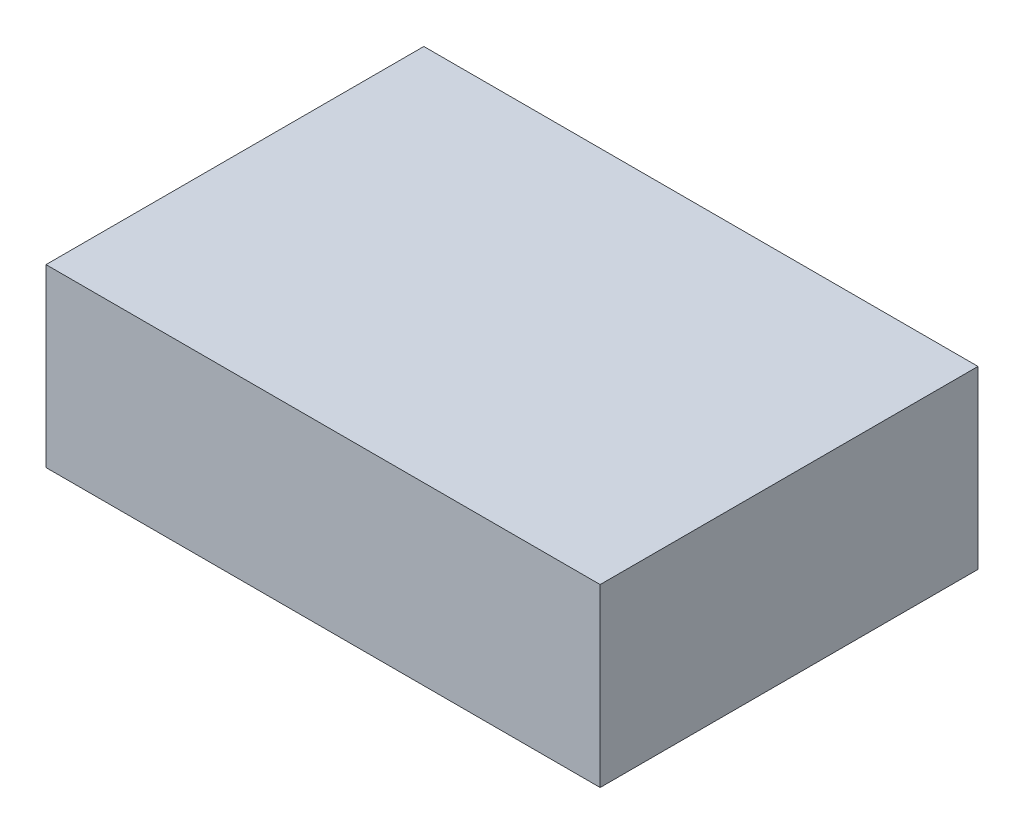
ISO-10303-21;
HEADER;
FILE_DESCRIPTION(('STEP AP214'),'2;1');
FILE_NAME('part.step','',(''),(''),'','','');
FILE_SCHEMA(('AUTOMOTIVE_DESIGN { 1 0 10303 214 1 1 1 1 }'));
ENDSEC;
DATA;
#1=APPLICATION_CONTEXT('core data for automotive mechanical design processes');
#2=APPLICATION_PROTOCOL_DEFINITION('international standard','automotive_design',2000,#1);
#3=PRODUCT_CONTEXT('',#1,'mechanical');
#4=PRODUCT('Part','Part','',(#3));
#5=PRODUCT_RELATED_PRODUCT_CATEGORY('part','',(#4));
#6=PRODUCT_DEFINITION_FORMATION('','',#4);
#7=PRODUCT_DEFINITION_CONTEXT('part definition',#1,'design');
#8=PRODUCT_DEFINITION('design','',#6,#7);
#9=PRODUCT_DEFINITION_SHAPE('','',#8);
#10=(LENGTH_UNIT() NAMED_UNIT(*) SI_UNIT(.MILLI.,.METRE.));
#11=(NAMED_UNIT(*) PLANE_ANGLE_UNIT() SI_UNIT($,.RADIAN.));
#12=(NAMED_UNIT(*) SI_UNIT($,.STERADIAN.) SOLID_ANGLE_UNIT());
#13=UNCERTAINTY_MEASURE_WITH_UNIT(LENGTH_MEASURE(1.E-05),#10,'distance_accuracy_value','');
#14=(GEOMETRIC_REPRESENTATION_CONTEXT(3) GLOBAL_UNCERTAINTY_ASSIGNED_CONTEXT((#13)) GLOBAL_UNIT_ASSIGNED_CONTEXT((#10,
#11,#12)) REPRESENTATION_CONTEXT('',''));
#15=CARTESIAN_POINT('',(0.,0.,0.));
#16=DIRECTION('',(0.,0.,1.));
#17=DIRECTION('',(1.,0.,0.));
#18=AXIS2_PLACEMENT_3D('',#15,#16,#17);
#19=CARTESIAN_POINT('',(0.,10.,0.));
#20=DIRECTION('',(1.,0.,0.));
#21=DIRECTION('',(0.,0.,-1.));
#22=AXIS2_PLACEMENT_3D('',#19,#20,#21);
#23=PLANE('',#22);
#24=DIRECTION('',(0.,0.,1.));
#25=VECTOR('',#24,1.);
#26=CARTESIAN_POINT('',(0.,0.,0.));
#27=LINE('',#26,#25);
#28=CARTESIAN_POINT('',(0.,0.,-21.4933944393991));
#29=VERTEX_POINT('',#28);
#30=CARTESIAN_POINT('',(0.,0.,0.));
#31=VERTEX_POINT('',#30);
#32=EDGE_CURVE('E111',#29,#31,#27,.T.);
#33=ORIENTED_EDGE('',*,*,#32,.T.);
#34=DIRECTION('',(0.,-1.,0.));
#35=VECTOR('',#34,1.);
#36=CARTESIAN_POINT('',(0.,10.,0.));
#37=LINE('',#36,#35);
#38=CARTESIAN_POINT('',(0.,10.,0.));
#39=VERTEX_POINT('',#38);
#40=EDGE_CURVE('E11',#39,#31,#37,.T.);
#41=ORIENTED_EDGE('',*,*,#40,.F.);
#42=DIRECTION('',(0.,0.,1.));
#43=VECTOR('',#42,1.);
#44=CARTESIAN_POINT('',(0.,10.,0.));
#45=LINE('',#44,#43);
#46=CARTESIAN_POINT('',(0.,10.,-21.4933944393991));
#47=VERTEX_POINT('',#46);
#48=EDGE_CURVE('E95',#47,#39,#45,.T.);
#49=ORIENTED_EDGE('',*,*,#48,.F.);
#50=DIRECTION('',(0.,-1.,0.));
#51=VECTOR('',#50,1.);
#52=CARTESIAN_POINT('',(0.,10.,-21.4933944393991));
#53=LINE('',#52,#51);
#54=EDGE_CURVE('E107',#47,#29,#53,.T.);
#55=ORIENTED_EDGE('',*,*,#54,.T.);
#56=EDGE_LOOP('',(#33,#41,#49,#55));
#57=FACE_BOUND('',#56,.T.);
#58=ADVANCED_FACE('F43',(#57),#23,.F.);
#59=CARTESIAN_POINT('',(0.,10.,0.));
#60=DIRECTION('',(0.,0.,-1.));
#61=DIRECTION('',(-1.,0.,0.));
#62=AXIS2_PLACEMENT_3D('',#59,#60,#61);
#63=PLANE('',#62);
#64=DIRECTION('',(1.,0.,0.));
#65=VECTOR('',#64,1.);
#66=CARTESIAN_POINT('',(0.,0.,0.));
#67=LINE('',#66,#65);
#68=CARTESIAN_POINT('',(31.5236451777854,0.,0.));
#69=VERTEX_POINT('',#68);
#70=EDGE_CURVE('E100',#31,#69,#67,.T.);
#71=ORIENTED_EDGE('',*,*,#70,.T.);
#72=DIRECTION('',(0.,-1.,0.));
#73=VECTOR('',#72,1.);
#74=CARTESIAN_POINT('',(31.5236451777854,10.,0.));
#75=LINE('',#74,#73);
#76=CARTESIAN_POINT('',(31.5236451777854,10.,0.));
#77=VERTEX_POINT('',#76);
#78=EDGE_CURVE('E52',#77,#69,#75,.T.);
#79=ORIENTED_EDGE('',*,*,#78,.F.);
#80=DIRECTION('',(1.,0.,0.));
#81=VECTOR('',#80,1.);
#82=CARTESIAN_POINT('',(0.,10.,0.));
#83=LINE('',#82,#81);
#84=EDGE_CURVE('E90',#39,#77,#83,.T.);
#85=ORIENTED_EDGE('',*,*,#84,.F.);
#86=ORIENTED_EDGE('',*,*,#40,.T.);
#87=EDGE_LOOP('',(#71,#79,#85,#86));
#88=FACE_BOUND('',#87,.T.);
#89=ADVANCED_FACE('F99',(#88),#63,.F.);
#90=CARTESIAN_POINT('',(31.5236451777854,10.,0.));
#91=DIRECTION('',(-1.,0.,0.));
#92=DIRECTION('',(0.,0.,1.));
#93=AXIS2_PLACEMENT_3D('',#90,#91,#92);
#94=PLANE('',#93);
#95=DIRECTION('',(0.,0.,-1.));
#96=VECTOR('',#95,1.);
#97=CARTESIAN_POINT('',(31.5236451777854,0.,0.));
#98=LINE('',#97,#96);
#99=CARTESIAN_POINT('',(31.5236451777854,0.,-21.4933944393991));
#100=VERTEX_POINT('',#99);
#101=EDGE_CURVE('E77',#69,#100,#98,.T.);
#102=ORIENTED_EDGE('',*,*,#101,.T.);
#103=DIRECTION('',(0.,-1.,0.));
#104=VECTOR('',#103,1.);
#105=CARTESIAN_POINT('',(31.5236451777854,10.,-21.4933944393991));
#106=LINE('',#105,#104);
#107=CARTESIAN_POINT('',(31.5236451777854,10.,-21.4933944393991));
#108=VERTEX_POINT('',#107);
#109=EDGE_CURVE('E102',#108,#100,#106,.T.);
#110=ORIENTED_EDGE('',*,*,#109,.F.);
#111=DIRECTION('',(0.,0.,-1.));
#112=VECTOR('',#111,1.);
#113=CARTESIAN_POINT('',(31.5236451777854,10.,0.));
#114=LINE('',#113,#112);
#115=EDGE_CURVE('E93',#77,#108,#114,.T.);
#116=ORIENTED_EDGE('',*,*,#115,.F.);
#117=ORIENTED_EDGE('',*,*,#78,.T.);
#118=EDGE_LOOP('',(#102,#110,#116,#117));
#119=FACE_BOUND('',#118,.T.);
#120=ADVANCED_FACE('F103',(#119),#94,.F.);
#121=CARTESIAN_POINT('',(0.,10.,-21.4933944393991));
#122=DIRECTION('',(0.,0.,1.));
#123=DIRECTION('',(1.,0.,0.));
#124=AXIS2_PLACEMENT_3D('',#121,#122,#123);
#125=PLANE('',#124);
#126=DIRECTION('',(-1.,0.,0.));
#127=VECTOR('',#126,1.);
#128=CARTESIAN_POINT('',(0.,0.,-21.4933944393991));
#129=LINE('',#128,#127);
#130=EDGE_CURVE('E83',#100,#29,#129,.T.);
#131=ORIENTED_EDGE('',*,*,#130,.T.);
#132=ORIENTED_EDGE('',*,*,#54,.F.);
#133=DIRECTION('',(-1.,0.,0.));
#134=VECTOR('',#133,1.);
#135=CARTESIAN_POINT('',(0.,10.,-21.4933944393991));
#136=LINE('',#135,#134);
#137=EDGE_CURVE('E60',#108,#47,#136,.T.);
#138=ORIENTED_EDGE('',*,*,#137,.F.);
#139=ORIENTED_EDGE('',*,*,#109,.T.);
#140=EDGE_LOOP('',(#131,#132,#138,#139));
#141=FACE_BOUND('',#140,.T.);
#142=ADVANCED_FACE('F124',(#141),#125,.F.);
#143=CARTESIAN_POINT('',(0.,10.,0.));
#144=DIRECTION('',(0.,-1.,0.));
#145=DIRECTION('',(0.,0.,-1.));
#146=AXIS2_PLACEMENT_3D('',#143,#144,#145);
#147=PLANE('',#146);
#148=ORIENTED_EDGE('',*,*,#48,.T.);
#149=ORIENTED_EDGE('',*,*,#84,.T.);
#150=ORIENTED_EDGE('',*,*,#115,.T.);
#151=ORIENTED_EDGE('',*,*,#137,.T.);
#152=EDGE_LOOP('',(#148,#149,#150,#151));
#153=FACE_BOUND('',#152,.T.);
#154=ADVANCED_FACE('F91',(#153),#147,.F.);
#155=CARTESIAN_POINT('',(0.,0.,0.));
#156=DIRECTION('',(0.,-1.,0.));
#157=DIRECTION('',(0.,0.,-1.));
#158=AXIS2_PLACEMENT_3D('',#155,#156,#157);
#159=PLANE('',#158);
#160=ORIENTED_EDGE('',*,*,#32,.F.);
#161=ORIENTED_EDGE('',*,*,#130,.F.);
#162=ORIENTED_EDGE('',*,*,#101,.F.);
#163=ORIENTED_EDGE('',*,*,#70,.F.);
#164=EDGE_LOOP('',(#160,#161,#162,#163));
#165=FACE_BOUND('',#164,.T.);
#166=ADVANCED_FACE('F127',(#165),#159,.T.);
#167=CLOSED_SHELL('',(#58,#89,#120,#142,#154,#166));
#168=MANIFOLD_SOLID_BREP('B2',#167);
#169=ADVANCED_BREP_SHAPE_REPRESENTATION('',(#18,#168),#14);
#170=SHAPE_DEFINITION_REPRESENTATION(#9,#169);
ENDSEC;
END-ISO-10303-21;
